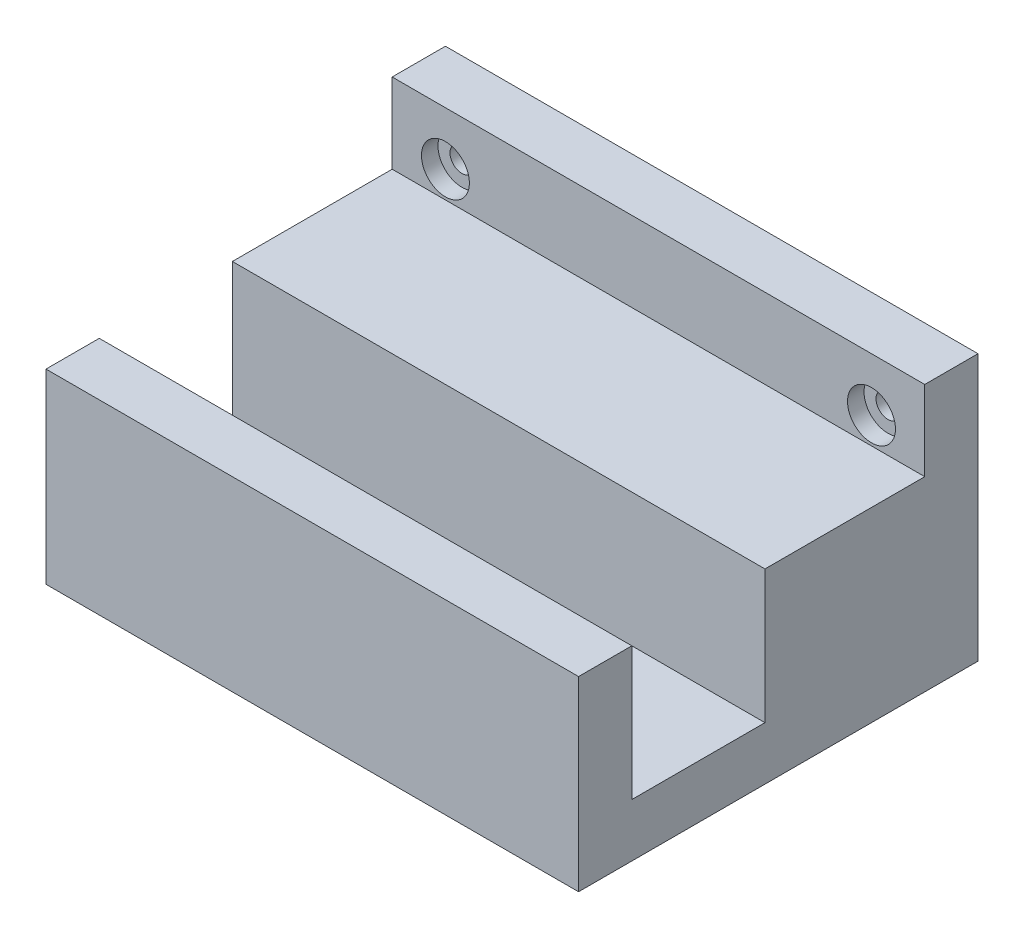
ISO-10303-21;
HEADER;
FILE_DESCRIPTION(('STEP AP214'),'2;1');
FILE_NAME('part.step','',(''),(''),'','','');
FILE_SCHEMA(('AUTOMOTIVE_DESIGN { 1 0 10303 214 1 1 1 1 }'));
ENDSEC;
DATA;
#1=APPLICATION_CONTEXT('core data for automotive mechanical design processes');
#2=APPLICATION_PROTOCOL_DEFINITION('international standard','automotive_design',2000,#1);
#3=PRODUCT_CONTEXT('',#1,'mechanical');
#4=PRODUCT('Part','Part','',(#3));
#5=PRODUCT_RELATED_PRODUCT_CATEGORY('part','',(#4));
#6=PRODUCT_DEFINITION_FORMATION('','',#4);
#7=PRODUCT_DEFINITION_CONTEXT('part definition',#1,'design');
#8=PRODUCT_DEFINITION('design','',#6,#7);
#9=PRODUCT_DEFINITION_SHAPE('','',#8);
#10=(LENGTH_UNIT() NAMED_UNIT(*) SI_UNIT(.MILLI.,.METRE.));
#11=(NAMED_UNIT(*) PLANE_ANGLE_UNIT() SI_UNIT($,.RADIAN.));
#12=(NAMED_UNIT(*) SI_UNIT($,.STERADIAN.) SOLID_ANGLE_UNIT());
#13=UNCERTAINTY_MEASURE_WITH_UNIT(LENGTH_MEASURE(1.E-05),#10,'distance_accuracy_value','');
#14=(GEOMETRIC_REPRESENTATION_CONTEXT(3) GLOBAL_UNCERTAINTY_ASSIGNED_CONTEXT((#13)) GLOBAL_UNIT_ASSIGNED_CONTEXT((#10,
#11,#12)) REPRESENTATION_CONTEXT('',''));
#15=CARTESIAN_POINT('',(0.,0.,0.));
#16=DIRECTION('',(0.,0.,1.));
#17=DIRECTION('',(1.,0.,0.));
#18=AXIS2_PLACEMENT_3D('',#15,#16,#17);
#19=CARTESIAN_POINT('',(0.,0.,10.));
#20=DIRECTION('',(0.,0.,-1.));
#21=DIRECTION('',(-1.,0.,0.));
#22=AXIS2_PLACEMENT_3D('',#19,#20,#21);
#23=PLANE('',#22);
#24=CARTESIAN_POINT('',(40.,15.,10.));
#25=DIRECTION('',(0.,0.,1.));
#26=DIRECTION('',(1.,0.,0.));
#27=AXIS2_PLACEMENT_3D('',#24,#25,#26);
#28=CIRCLE('',#27,4.49999999999999);
#29=CARTESIAN_POINT('',(44.5,15.,10.));
#30=VERTEX_POINT('',#29);
#31=EDGE_CURVE('E148',#30,#30,#28,.T.);
#32=ORIENTED_EDGE('',*,*,#31,.F.);
#33=EDGE_LOOP('',(#32));
#34=FACE_BOUND('',#33,.T.);
#35=CARTESIAN_POINT('',(-40.,15.,10.));
#36=DIRECTION('',(0.,0.,1.));
#37=DIRECTION('',(1.,0.,0.));
#38=AXIS2_PLACEMENT_3D('',#35,#36,#37);
#39=CIRCLE('',#38,4.5);
#40=CARTESIAN_POINT('',(-35.5,15.,10.));
#41=VERTEX_POINT('',#40);
#42=EDGE_CURVE('E136',#41,#41,#39,.T.);
#43=ORIENTED_EDGE('',*,*,#42,.F.);
#44=EDGE_LOOP('',(#43));
#45=FACE_BOUND('',#44,.T.);
#46=DIRECTION('',(-1.,0.,0.));
#47=VECTOR('',#46,1.);
#48=CARTESIAN_POINT('',(-50.,10.,10.));
#49=LINE('',#48,#47);
#50=CARTESIAN_POINT('',(50.,10.,10.));
#51=VERTEX_POINT('',#50);
#52=CARTESIAN_POINT('',(-50.,10.,10.));
#53=VERTEX_POINT('',#52);
#54=EDGE_CURVE('E56',#51,#53,#49,.T.);
#55=ORIENTED_EDGE('',*,*,#54,.F.);
#56=DIRECTION('',(0.,1.,0.));
#57=VECTOR('',#56,1.);
#58=CARTESIAN_POINT('',(50.,-25.,10.));
#59=LINE('',#58,#57);
#60=CARTESIAN_POINT('',(50.,25.,10.));
#61=VERTEX_POINT('',#60);
#62=EDGE_CURVE('E123',#51,#61,#59,.T.);
#63=ORIENTED_EDGE('',*,*,#62,.T.);
#64=DIRECTION('',(-1.,0.,0.));
#65=VECTOR('',#64,1.);
#66=CARTESIAN_POINT('',(-50.,25.,10.));
#67=LINE('',#66,#65);
#68=CARTESIAN_POINT('',(-50.,25.,10.));
#69=VERTEX_POINT('',#68);
#70=EDGE_CURVE('E191',#61,#69,#67,.T.);
#71=ORIENTED_EDGE('',*,*,#70,.T.);
#72=DIRECTION('',(0.,-1.,0.));
#73=VECTOR('',#72,1.);
#74=CARTESIAN_POINT('',(-50.,-25.,10.));
#75=LINE('',#74,#73);
#76=EDGE_CURVE('E194',#69,#53,#75,.T.);
#77=ORIENTED_EDGE('',*,*,#76,.T.);
#78=EDGE_LOOP('',(#55,#63,#71,#77));
#79=FACE_BOUND('',#78,.T.);
#80=ADVANCED_FACE('F33',(#34,#45,#79),#23,.F.);
#81=CARTESIAN_POINT('',(-50.,-15.,75.));
#82=DIRECTION('',(0.,-1.,0.));
#83=DIRECTION('',(0.,0.,-1.));
#84=AXIS2_PLACEMENT_3D('',#81,#82,#83);
#85=PLANE('',#84);
#86=DIRECTION('',(0.,0.,-1.));
#87=VECTOR('',#86,1.);
#88=CARTESIAN_POINT('',(50.,-15.,75.));
#89=LINE('',#88,#87);
#90=CARTESIAN_POINT('',(50.,-15.,65.));
#91=VERTEX_POINT('',#90);
#92=CARTESIAN_POINT('',(50.,-15.,40.));
#93=VERTEX_POINT('',#92);
#94=EDGE_CURVE('E48',#91,#93,#89,.T.);
#95=ORIENTED_EDGE('',*,*,#94,.T.);
#96=DIRECTION('',(-1.,0.,0.));
#97=VECTOR('',#96,1.);
#98=CARTESIAN_POINT('',(-50.,-15.,40.));
#99=LINE('',#98,#97);
#100=CARTESIAN_POINT('',(-50.,-15.,40.));
#101=VERTEX_POINT('',#100);
#102=EDGE_CURVE('E116',#93,#101,#99,.T.);
#103=ORIENTED_EDGE('',*,*,#102,.T.);
#104=DIRECTION('',(0.,0.,-1.));
#105=VECTOR('',#104,1.);
#106=CARTESIAN_POINT('',(-50.,-15.,75.));
#107=LINE('',#106,#105);
#108=CARTESIAN_POINT('',(-50.,-15.,65.));
#109=VERTEX_POINT('',#108);
#110=EDGE_CURVE('E185',#109,#101,#107,.T.);
#111=ORIENTED_EDGE('',*,*,#110,.F.);
#112=DIRECTION('',(-1.,0.,0.));
#113=VECTOR('',#112,1.);
#114=CARTESIAN_POINT('',(-50.,-15.,65.));
#115=LINE('',#114,#113);
#116=EDGE_CURVE('E11',#91,#109,#115,.T.);
#117=ORIENTED_EDGE('',*,*,#116,.F.);
#118=EDGE_LOOP('',(#95,#103,#111,#117));
#119=FACE_BOUND('',#118,.T.);
#120=ADVANCED_FACE('F227',(#119),#85,.F.);
#121=CARTESIAN_POINT('',(50.,-25.,10.));
#122=DIRECTION('',(-1.,0.,0.));
#123=DIRECTION('',(0.,0.,1.));
#124=AXIS2_PLACEMENT_3D('',#121,#122,#123);
#125=PLANE('',#124);
#126=DIRECTION('',(0.,0.,-1.));
#127=VECTOR('',#126,1.);
#128=CARTESIAN_POINT('',(50.,-25.,10.));
#129=LINE('',#128,#127);
#130=CARTESIAN_POINT('',(50.,-25.,75.));
#131=VERTEX_POINT('',#130);
#132=CARTESIAN_POINT('',(50.,-25.,0.));
#133=VERTEX_POINT('',#132);
#134=EDGE_CURVE('E196',#131,#133,#129,.T.);
#135=ORIENTED_EDGE('',*,*,#134,.T.);
#136=DIRECTION('',(0.,1.,0.));
#137=VECTOR('',#136,1.);
#138=CARTESIAN_POINT('',(50.,-25.,0.));
#139=LINE('',#138,#137);
#140=CARTESIAN_POINT('',(50.,25.,0.));
#141=VERTEX_POINT('',#140);
#142=EDGE_CURVE('E189',#133,#141,#139,.T.);
#143=ORIENTED_EDGE('',*,*,#142,.T.);
#144=DIRECTION('',(0.,0.,-1.));
#145=VECTOR('',#144,1.);
#146=CARTESIAN_POINT('',(50.,25.,10.));
#147=LINE('',#146,#145);
#148=EDGE_CURVE('E41',#61,#141,#147,.T.);
#149=ORIENTED_EDGE('',*,*,#148,.F.);
#150=ORIENTED_EDGE('',*,*,#62,.F.);
#151=DIRECTION('',(0.,0.,-1.));
#152=VECTOR('',#151,1.);
#153=CARTESIAN_POINT('',(50.,10.,40.));
#154=LINE('',#153,#152);
#155=CARTESIAN_POINT('',(50.,10.,40.));
#156=VERTEX_POINT('',#155);
#157=EDGE_CURVE('E121',#156,#51,#154,.T.);
#158=ORIENTED_EDGE('',*,*,#157,.F.);
#159=DIRECTION('',(0.,1.,0.));
#160=VECTOR('',#159,1.);
#161=CARTESIAN_POINT('',(50.,10.,40.));
#162=LINE('',#161,#160);
#163=EDGE_CURVE('E109',#93,#156,#162,.T.);
#164=ORIENTED_EDGE('',*,*,#163,.F.);
#165=ORIENTED_EDGE('',*,*,#94,.F.);
#166=DIRECTION('',(0.,1.,0.));
#167=VECTOR('',#166,1.);
#168=CARTESIAN_POINT('',(50.,10.,65.));
#169=LINE('',#168,#167);
#170=CARTESIAN_POINT('',(50.,10.,65.));
#171=VERTEX_POINT('',#170);
#172=EDGE_CURVE('E164',#91,#171,#169,.T.);
#173=ORIENTED_EDGE('',*,*,#172,.T.);
#174=DIRECTION('',(0.,0.,1.));
#175=VECTOR('',#174,1.);
#176=CARTESIAN_POINT('',(50.,10.,65.));
#177=LINE('',#176,#175);
#178=CARTESIAN_POINT('',(50.,10.,75.));
#179=VERTEX_POINT('',#178);
#180=EDGE_CURVE('E169',#171,#179,#177,.T.);
#181=ORIENTED_EDGE('',*,*,#180,.T.);
#182=DIRECTION('',(0.,1.,0.));
#183=VECTOR('',#182,1.);
#184=CARTESIAN_POINT('',(50.,-25.,75.));
#185=LINE('',#184,#183);
#186=EDGE_CURVE('E183',#131,#179,#185,.T.);
#187=ORIENTED_EDGE('',*,*,#186,.F.);
#188=EDGE_LOOP('',(#135,#143,#149,#150,#158,#164,#165,#173,#181,#187));
#189=FACE_BOUND('',#188,.T.);
#190=ADVANCED_FACE('F35',(#189),#125,.F.);
#191=CARTESIAN_POINT('',(-50.,25.,10.));
#192=DIRECTION('',(0.,-1.,0.));
#193=DIRECTION('',(0.,0.,-1.));
#194=AXIS2_PLACEMENT_3D('',#191,#192,#193);
#195=PLANE('',#194);
#196=DIRECTION('',(-1.,0.,0.));
#197=VECTOR('',#196,1.);
#198=CARTESIAN_POINT('',(-50.,25.,0.));
#199=LINE('',#198,#197);
#200=CARTESIAN_POINT('',(-50.,25.,0.));
#201=VERTEX_POINT('',#200);
#202=EDGE_CURVE('E198',#141,#201,#199,.T.);
#203=ORIENTED_EDGE('',*,*,#202,.T.);
#204=DIRECTION('',(0.,0.,-1.));
#205=VECTOR('',#204,1.);
#206=CARTESIAN_POINT('',(-50.,25.,10.));
#207=LINE('',#206,#205);
#208=EDGE_CURVE('E208',#69,#201,#207,.T.);
#209=ORIENTED_EDGE('',*,*,#208,.F.);
#210=ORIENTED_EDGE('',*,*,#70,.F.);
#211=ORIENTED_EDGE('',*,*,#148,.T.);
#212=EDGE_LOOP('',(#203,#209,#210,#211));
#213=FACE_BOUND('',#212,.T.);
#214=ADVANCED_FACE('F213',(#213),#195,.F.);
#215=CARTESIAN_POINT('',(-50.,-25.,10.));
#216=DIRECTION('',(1.,0.,0.));
#217=DIRECTION('',(0.,0.,-1.));
#218=AXIS2_PLACEMENT_3D('',#215,#216,#217);
#219=PLANE('',#218);
#220=ORIENTED_EDGE('',*,*,#110,.T.);
#221=DIRECTION('',(0.,-1.,0.));
#222=VECTOR('',#221,1.);
#223=CARTESIAN_POINT('',(-50.,10.,40.));
#224=LINE('',#223,#222);
#225=CARTESIAN_POINT('',(-50.,10.,40.));
#226=VERTEX_POINT('',#225);
#227=EDGE_CURVE('E118',#226,#101,#224,.T.);
#228=ORIENTED_EDGE('',*,*,#227,.F.);
#229=DIRECTION('',(0.,0.,-1.));
#230=VECTOR('',#229,1.);
#231=CARTESIAN_POINT('',(-50.,10.,40.));
#232=LINE('',#231,#230);
#233=EDGE_CURVE('E125',#226,#53,#232,.T.);
#234=ORIENTED_EDGE('',*,*,#233,.T.);
#235=ORIENTED_EDGE('',*,*,#76,.F.);
#236=ORIENTED_EDGE('',*,*,#208,.T.);
#237=DIRECTION('',(0.,-1.,0.));
#238=VECTOR('',#237,1.);
#239=CARTESIAN_POINT('',(-50.,-25.,0.));
#240=LINE('',#239,#238);
#241=CARTESIAN_POINT('',(-50.,-25.,0.));
#242=VERTEX_POINT('',#241);
#243=EDGE_CURVE('E200',#201,#242,#240,.T.);
#244=ORIENTED_EDGE('',*,*,#243,.T.);
#245=DIRECTION('',(0.,0.,-1.));
#246=VECTOR('',#245,1.);
#247=CARTESIAN_POINT('',(-50.,-25.,10.));
#248=LINE('',#247,#246);
#249=CARTESIAN_POINT('',(-50.,-25.,75.));
#250=VERTEX_POINT('',#249);
#251=EDGE_CURVE('E206',#250,#242,#248,.T.);
#252=ORIENTED_EDGE('',*,*,#251,.F.);
#253=DIRECTION('',(0.,-1.,0.));
#254=VECTOR('',#253,1.);
#255=CARTESIAN_POINT('',(-50.,-25.,75.));
#256=LINE('',#255,#254);
#257=CARTESIAN_POINT('',(-50.,10.,75.));
#258=VERTEX_POINT('',#257);
#259=EDGE_CURVE('E175',#258,#250,#256,.T.);
#260=ORIENTED_EDGE('',*,*,#259,.F.);
#261=DIRECTION('',(0.,0.,1.));
#262=VECTOR('',#261,1.);
#263=CARTESIAN_POINT('',(-50.,10.,65.));
#264=LINE('',#263,#262);
#265=CARTESIAN_POINT('',(-50.,10.,65.));
#266=VERTEX_POINT('',#265);
#267=EDGE_CURVE('E172',#266,#258,#264,.T.);
#268=ORIENTED_EDGE('',*,*,#267,.F.);
#269=DIRECTION('',(0.,-1.,0.));
#270=VECTOR('',#269,1.);
#271=CARTESIAN_POINT('',(-50.,10.,65.));
#272=LINE('',#271,#270);
#273=EDGE_CURVE('E161',#266,#109,#272,.T.);
#274=ORIENTED_EDGE('',*,*,#273,.T.);
#275=EDGE_LOOP('',(#220,#228,#234,#235,#236,#244,#252,#260,#268,#274));
#276=FACE_BOUND('',#275,.T.);
#277=ADVANCED_FACE('F223',(#276),#219,.F.);
#278=CARTESIAN_POINT('',(-50.,-25.,10.));
#279=DIRECTION('',(0.,1.,0.));
#280=DIRECTION('',(0.,0.,1.));
#281=AXIS2_PLACEMENT_3D('',#278,#279,#280);
#282=PLANE('',#281);
#283=ORIENTED_EDGE('',*,*,#251,.T.);
#284=DIRECTION('',(1.,0.,0.));
#285=VECTOR('',#284,1.);
#286=CARTESIAN_POINT('',(-50.,-25.,0.));
#287=LINE('',#286,#285);
#288=EDGE_CURVE('E192',#242,#133,#287,.T.);
#289=ORIENTED_EDGE('',*,*,#288,.T.);
#290=ORIENTED_EDGE('',*,*,#134,.F.);
#291=DIRECTION('',(1.,0.,0.));
#292=VECTOR('',#291,1.);
#293=CARTESIAN_POINT('',(-50.,-25.,75.));
#294=LINE('',#293,#292);
#295=EDGE_CURVE('E180',#250,#131,#294,.T.);
#296=ORIENTED_EDGE('',*,*,#295,.F.);
#297=EDGE_LOOP('',(#283,#289,#290,#296));
#298=FACE_BOUND('',#297,.T.);
#299=ADVANCED_FACE('F241',(#298),#282,.F.);
#300=CARTESIAN_POINT('',(0.,0.,0.));
#301=DIRECTION('',(0.,0.,-1.));
#302=DIRECTION('',(-1.,0.,0.));
#303=AXIS2_PLACEMENT_3D('',#300,#301,#302);
#304=PLANE('',#303);
#305=CARTESIAN_POINT('',(-40.,15.,0.));
#306=DIRECTION('',(0.,0.,1.));
#307=DIRECTION('',(1.,0.,0.));
#308=AXIS2_PLACEMENT_3D('',#305,#306,#307);
#309=CIRCLE('',#308,2.25);
#310=CARTESIAN_POINT('',(-37.75,15.,0.));
#311=VERTEX_POINT('',#310);
#312=EDGE_CURVE('E145',#311,#311,#309,.T.);
#313=ORIENTED_EDGE('',*,*,#312,.T.);
#314=EDGE_LOOP('',(#313));
#315=FACE_BOUND('',#314,.T.);
#316=CARTESIAN_POINT('',(40.,15.,0.));
#317=DIRECTION('',(0.,0.,1.));
#318=DIRECTION('',(1.,0.,0.));
#319=AXIS2_PLACEMENT_3D('',#316,#317,#318);
#320=CIRCLE('',#319,2.25);
#321=CARTESIAN_POINT('',(42.25,15.,0.));
#322=VERTEX_POINT('',#321);
#323=EDGE_CURVE('E157',#322,#322,#320,.T.);
#324=ORIENTED_EDGE('',*,*,#323,.T.);
#325=EDGE_LOOP('',(#324));
#326=FACE_BOUND('',#325,.T.);
#327=ORIENTED_EDGE('',*,*,#288,.F.);
#328=ORIENTED_EDGE('',*,*,#243,.F.);
#329=ORIENTED_EDGE('',*,*,#202,.F.);
#330=ORIENTED_EDGE('',*,*,#142,.F.);
#331=EDGE_LOOP('',(#327,#328,#329,#330));
#332=FACE_BOUND('',#331,.T.);
#333=ADVANCED_FACE('F221',(#315,#326,#332),#304,.T.);
#334=CARTESIAN_POINT('',(0.,0.,75.));
#335=DIRECTION('',(0.,0.,-1.));
#336=DIRECTION('',(-1.,0.,0.));
#337=AXIS2_PLACEMENT_3D('',#334,#335,#336);
#338=PLANE('',#337);
#339=ORIENTED_EDGE('',*,*,#259,.T.);
#340=ORIENTED_EDGE('',*,*,#295,.T.);
#341=ORIENTED_EDGE('',*,*,#186,.T.);
#342=DIRECTION('',(-1.,0.,0.));
#343=VECTOR('',#342,1.);
#344=CARTESIAN_POINT('',(-50.,10.,75.));
#345=LINE('',#344,#343);
#346=EDGE_CURVE('E160',#179,#258,#345,.T.);
#347=ORIENTED_EDGE('',*,*,#346,.T.);
#348=EDGE_LOOP('',(#339,#340,#341,#347));
#349=FACE_BOUND('',#348,.T.);
#350=ADVANCED_FACE('F240',(#349),#338,.F.);
#351=CARTESIAN_POINT('',(0.,0.,65.));
#352=DIRECTION('',(0.,0.,1.));
#353=DIRECTION('',(1.,0.,0.));
#354=AXIS2_PLACEMENT_3D('',#351,#352,#353);
#355=PLANE('',#354);
#356=ORIENTED_EDGE('',*,*,#172,.F.);
#357=ORIENTED_EDGE('',*,*,#116,.T.);
#358=ORIENTED_EDGE('',*,*,#273,.F.);
#359=DIRECTION('',(-1.,0.,0.));
#360=VECTOR('',#359,1.);
#361=CARTESIAN_POINT('',(-50.,10.,65.));
#362=LINE('',#361,#360);
#363=EDGE_CURVE('E166',#171,#266,#362,.T.);
#364=ORIENTED_EDGE('',*,*,#363,.F.);
#365=EDGE_LOOP('',(#356,#357,#358,#364));
#366=FACE_BOUND('',#365,.T.);
#367=ADVANCED_FACE('F344',(#366),#355,.F.);
#368=CARTESIAN_POINT('',(-50.,10.,65.));
#369=DIRECTION('',(0.,1.,0.));
#370=DIRECTION('',(0.,0.,1.));
#371=AXIS2_PLACEMENT_3D('',#368,#369,#370);
#372=PLANE('',#371);
#373=ORIENTED_EDGE('',*,*,#346,.F.);
#374=ORIENTED_EDGE('',*,*,#180,.F.);
#375=ORIENTED_EDGE('',*,*,#363,.T.);
#376=ORIENTED_EDGE('',*,*,#267,.T.);
#377=EDGE_LOOP('',(#373,#374,#375,#376));
#378=FACE_BOUND('',#377,.T.);
#379=ADVANCED_FACE('F325',(#378),#372,.T.);
#380=CARTESIAN_POINT('',(40.,15.,10.));
#381=DIRECTION('',(0.,0.,1.));
#382=DIRECTION('',(1.,0.,0.));
#383=AXIS2_PLACEMENT_3D('',#380,#381,#382);
#384=CYLINDRICAL_SURFACE('',#383,2.25000000000001);
#385=ORIENTED_EDGE('',*,*,#323,.F.);
#386=EDGE_LOOP('',(#385));
#387=FACE_BOUND('',#386,.T.);
#388=CARTESIAN_POINT('',(40.,15.,6.9));
#389=DIRECTION('',(0.,0.,1.));
#390=DIRECTION('',(1.,0.,0.));
#391=AXIS2_PLACEMENT_3D('',#388,#389,#390);
#392=CIRCLE('',#391,2.25000000000002);
#393=CARTESIAN_POINT('',(42.25,15.,6.9));
#394=VERTEX_POINT('',#393);
#395=EDGE_CURVE('E154',#394,#394,#392,.T.);
#396=ORIENTED_EDGE('',*,*,#395,.T.);
#397=EDGE_LOOP('',(#396));
#398=FACE_BOUND('',#397,.T.);
#399=ADVANCED_FACE('F315',(#387,#398),#384,.F.);
#400=CARTESIAN_POINT('',(42.25,15.,6.9));
#401=DIRECTION('',(0.,0.,-1.));
#402=DIRECTION('',(-1.,0.,0.));
#403=AXIS2_PLACEMENT_3D('',#400,#401,#402);
#404=PLANE('',#403);
#405=ORIENTED_EDGE('',*,*,#395,.F.);
#406=EDGE_LOOP('',(#405));
#407=FACE_BOUND('',#406,.T.);
#408=CARTESIAN_POINT('',(40.,15.,6.9));
#409=DIRECTION('',(0.,0.,1.));
#410=DIRECTION('',(1.,0.,0.));
#411=AXIS2_PLACEMENT_3D('',#408,#409,#410);
#412=CIRCLE('',#411,4.49999999999999);
#413=CARTESIAN_POINT('',(44.5,15.,6.9));
#414=VERTEX_POINT('',#413);
#415=EDGE_CURVE('E151',#414,#414,#412,.T.);
#416=ORIENTED_EDGE('',*,*,#415,.T.);
#417=EDGE_LOOP('',(#416));
#418=FACE_BOUND('',#417,.T.);
#419=ADVANCED_FACE('F305',(#407,#418),#404,.F.);
#420=CARTESIAN_POINT('',(40.,15.,10.));
#421=DIRECTION('',(0.,0.,1.));
#422=DIRECTION('',(1.,0.,0.));
#423=AXIS2_PLACEMENT_3D('',#420,#421,#422);
#424=CYLINDRICAL_SURFACE('',#423,4.49999999999999);
#425=ORIENTED_EDGE('',*,*,#415,.F.);
#426=EDGE_LOOP('',(#425));
#427=FACE_BOUND('',#426,.T.);
#428=ORIENTED_EDGE('',*,*,#31,.T.);
#429=EDGE_LOOP('',(#428));
#430=FACE_BOUND('',#429,.T.);
#431=ADVANCED_FACE('F295',(#427,#430),#424,.F.);
#432=CARTESIAN_POINT('',(-40.,15.,10.));
#433=DIRECTION('',(0.,0.,1.));
#434=DIRECTION('',(1.,0.,0.));
#435=AXIS2_PLACEMENT_3D('',#432,#433,#434);
#436=CYLINDRICAL_SURFACE('',#435,2.25);
#437=ORIENTED_EDGE('',*,*,#312,.F.);
#438=EDGE_LOOP('',(#437));
#439=FACE_BOUND('',#438,.T.);
#440=CARTESIAN_POINT('',(-40.,15.,6.9));
#441=DIRECTION('',(0.,0.,1.));
#442=DIRECTION('',(1.,0.,0.));
#443=AXIS2_PLACEMENT_3D('',#440,#441,#442);
#444=CIRCLE('',#443,2.25000000000001);
#445=CARTESIAN_POINT('',(-37.75,15.,6.9));
#446=VERTEX_POINT('',#445);
#447=EDGE_CURVE('E142',#446,#446,#444,.T.);
#448=ORIENTED_EDGE('',*,*,#447,.T.);
#449=EDGE_LOOP('',(#448));
#450=FACE_BOUND('',#449,.T.);
#451=ADVANCED_FACE('F285',(#439,#450),#436,.F.);
#452=CARTESIAN_POINT('',(-37.75,15.,6.9));
#453=DIRECTION('',(0.,0.,-1.));
#454=DIRECTION('',(-1.,0.,0.));
#455=AXIS2_PLACEMENT_3D('',#452,#453,#454);
#456=PLANE('',#455);
#457=ORIENTED_EDGE('',*,*,#447,.F.);
#458=EDGE_LOOP('',(#457));
#459=FACE_BOUND('',#458,.T.);
#460=CARTESIAN_POINT('',(-40.,15.,6.9));
#461=DIRECTION('',(0.,0.,1.));
#462=DIRECTION('',(1.,0.,0.));
#463=AXIS2_PLACEMENT_3D('',#460,#461,#462);
#464=CIRCLE('',#463,4.5);
#465=CARTESIAN_POINT('',(-35.5,15.,6.9));
#466=VERTEX_POINT('',#465);
#467=EDGE_CURVE('E139',#466,#466,#464,.T.);
#468=ORIENTED_EDGE('',*,*,#467,.T.);
#469=EDGE_LOOP('',(#468));
#470=FACE_BOUND('',#469,.T.);
#471=ADVANCED_FACE('F274',(#459,#470),#456,.F.);
#472=CARTESIAN_POINT('',(-40.,15.,10.));
#473=DIRECTION('',(0.,0.,1.));
#474=DIRECTION('',(1.,0.,0.));
#475=AXIS2_PLACEMENT_3D('',#472,#473,#474);
#476=CYLINDRICAL_SURFACE('',#475,4.5);
#477=ORIENTED_EDGE('',*,*,#467,.F.);
#478=EDGE_LOOP('',(#477));
#479=FACE_BOUND('',#478,.T.);
#480=ORIENTED_EDGE('',*,*,#42,.T.);
#481=EDGE_LOOP('',(#480));
#482=FACE_BOUND('',#481,.T.);
#483=ADVANCED_FACE('F270',(#479,#482),#476,.F.);
#484=CARTESIAN_POINT('',(0.,0.,40.));
#485=DIRECTION('',(0.,0.,1.));
#486=DIRECTION('',(1.,0.,0.));
#487=AXIS2_PLACEMENT_3D('',#484,#485,#486);
#488=PLANE('',#487);
#489=ORIENTED_EDGE('',*,*,#102,.F.);
#490=ORIENTED_EDGE('',*,*,#163,.T.);
#491=DIRECTION('',(-1.,0.,0.));
#492=VECTOR('',#491,1.);
#493=CARTESIAN_POINT('',(-50.,10.,40.));
#494=LINE('',#493,#492);
#495=EDGE_CURVE('E114',#156,#226,#494,.T.);
#496=ORIENTED_EDGE('',*,*,#495,.T.);
#497=ORIENTED_EDGE('',*,*,#227,.T.);
#498=EDGE_LOOP('',(#489,#490,#496,#497));
#499=FACE_BOUND('',#498,.T.);
#500=ADVANCED_FACE('F111',(#499),#488,.T.);
#501=CARTESIAN_POINT('',(-50.,10.,40.));
#502=DIRECTION('',(0.,-1.,0.));
#503=DIRECTION('',(0.,0.,-1.));
#504=AXIS2_PLACEMENT_3D('',#501,#502,#503);
#505=PLANE('',#504);
#506=ORIENTED_EDGE('',*,*,#54,.T.);
#507=ORIENTED_EDGE('',*,*,#233,.F.);
#508=ORIENTED_EDGE('',*,*,#495,.F.);
#509=ORIENTED_EDGE('',*,*,#157,.T.);
#510=EDGE_LOOP('',(#506,#507,#508,#509));
#511=FACE_BOUND('',#510,.T.);
#512=ADVANCED_FACE('F127',(#511),#505,.F.);
#513=CLOSED_SHELL('',(#80,#120,#190,#214,#277,#299,#333,#350,#367,#379,#399,#419,#431,#451,#471,
#483,#500,#512));
#514=MANIFOLD_SOLID_BREP('B2',#513);
#515=ADVANCED_BREP_SHAPE_REPRESENTATION('',(#18,#514),#14);
#516=SHAPE_DEFINITION_REPRESENTATION(#9,#515);
ENDSEC;
END-ISO-10303-21;
